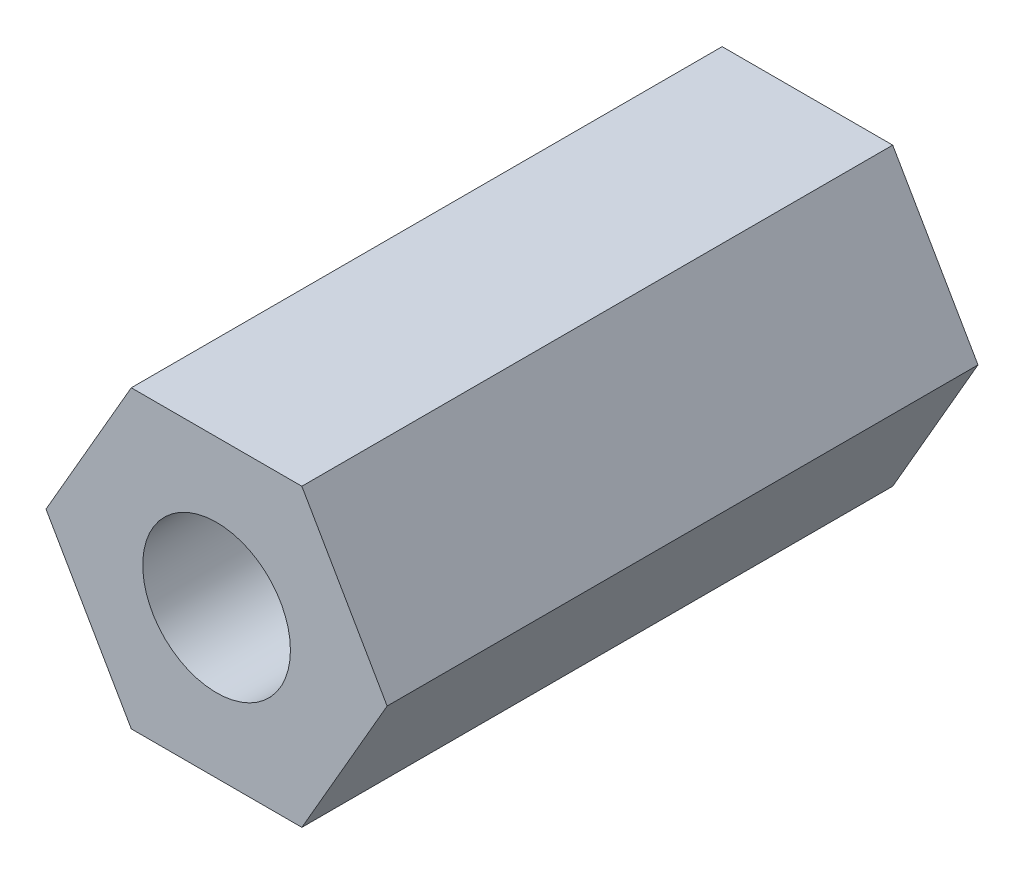
ISO-10303-21;
HEADER;
FILE_DESCRIPTION(('STEP AP214'),'2;1');
FILE_NAME('part.step','',(''),(''),'','','');
FILE_SCHEMA(('AUTOMOTIVE_DESIGN { 1 0 10303 214 1 1 1 1 }'));
ENDSEC;
DATA;
#1=APPLICATION_CONTEXT('core data for automotive mechanical design processes');
#2=APPLICATION_PROTOCOL_DEFINITION('international standard','automotive_design',2000,#1);
#3=PRODUCT_CONTEXT('',#1,'mechanical');
#4=PRODUCT('Part','Part','',(#3));
#5=PRODUCT_RELATED_PRODUCT_CATEGORY('part','',(#4));
#6=PRODUCT_DEFINITION_FORMATION('','',#4);
#7=PRODUCT_DEFINITION_CONTEXT('part definition',#1,'design');
#8=PRODUCT_DEFINITION('design','',#6,#7);
#9=PRODUCT_DEFINITION_SHAPE('','',#8);
#10=(LENGTH_UNIT() NAMED_UNIT(*) SI_UNIT(.MILLI.,.METRE.));
#11=(NAMED_UNIT(*) PLANE_ANGLE_UNIT() SI_UNIT($,.RADIAN.));
#12=(NAMED_UNIT(*) SI_UNIT($,.STERADIAN.) SOLID_ANGLE_UNIT());
#13=UNCERTAINTY_MEASURE_WITH_UNIT(LENGTH_MEASURE(1.E-05),#10,'distance_accuracy_value','');
#14=(GEOMETRIC_REPRESENTATION_CONTEXT(3) GLOBAL_UNCERTAINTY_ASSIGNED_CONTEXT((#13)) GLOBAL_UNIT_ASSIGNED_CONTEXT((#10,
#11,#12)) REPRESENTATION_CONTEXT('',''));
#15=CARTESIAN_POINT('',(0.,0.,0.));
#16=DIRECTION('',(0.,0.,1.));
#17=DIRECTION('',(1.,0.,0.));
#18=AXIS2_PLACEMENT_3D('',#15,#16,#17);
#19=CARTESIAN_POINT('',(0.,0.,12.));
#20=DIRECTION('',(0.,0.,1.));
#21=DIRECTION('',(1.,0.,0.));
#22=AXIS2_PLACEMENT_3D('',#19,#20,#21);
#23=PLANE('',#22);
#24=DIRECTION('',(0.499999999999995,0.866025403784441,0.));
#25=VECTOR('',#24,1.);
#26=CARTESIAN_POINT('',(1.73205080756891,-2.99999999999998,12.));
#27=LINE('',#26,#25);
#28=CARTESIAN_POINT('',(1.73205080756891,-2.99999999999998,12.));
#29=VERTEX_POINT('',#28);
#30=CARTESIAN_POINT('',(3.46410161513776,0.,12.));
#31=VERTEX_POINT('',#30);
#32=EDGE_CURVE('E154',#29,#31,#27,.T.);
#33=ORIENTED_EDGE('',*,*,#32,.T.);
#34=DIRECTION('',(-0.500000000000001,0.866025403784438,0.));
#35=VECTOR('',#34,1.);
#36=CARTESIAN_POINT('',(3.46410161513776,0.,12.));
#37=LINE('',#36,#35);
#38=CARTESIAN_POINT('',(1.73205080756887,3.00000000000001,12.));
#39=VERTEX_POINT('',#38);
#40=EDGE_CURVE('E102',#31,#39,#37,.T.);
#41=ORIENTED_EDGE('',*,*,#40,.T.);
#42=DIRECTION('',(-1.,0.,0.));
#43=VECTOR('',#42,1.);
#44=CARTESIAN_POINT('',(1.73205080756887,3.00000000000001,12.));
#45=LINE('',#44,#43);
#46=CARTESIAN_POINT('',(-1.73205080756889,2.99999999999999,12.));
#47=VERTEX_POINT('',#46);
#48=EDGE_CURVE('E115',#39,#47,#45,.T.);
#49=ORIENTED_EDGE('',*,*,#48,.T.);
#50=DIRECTION('',(-0.499999999999995,-0.866025403784442,0.));
#51=VECTOR('',#50,1.);
#52=CARTESIAN_POINT('',(-1.73205080756889,2.99999999999999,12.));
#53=LINE('',#52,#51);
#54=CARTESIAN_POINT('',(-3.46410161513776,0.,12.));
#55=VERTEX_POINT('',#54);
#56=EDGE_CURVE('E109',#47,#55,#53,.T.);
#57=ORIENTED_EDGE('',*,*,#56,.T.);
#58=DIRECTION('',(0.500000000000007,-0.866025403784434,0.));
#59=VECTOR('',#58,1.);
#60=CARTESIAN_POINT('',(-3.46410161513776,0.,12.));
#61=LINE('',#60,#59);
#62=CARTESIAN_POINT('',(-1.73205080756885,-3.00000000000002,12.));
#63=VERTEX_POINT('',#62);
#64=EDGE_CURVE('E113',#55,#63,#61,.T.);
#65=ORIENTED_EDGE('',*,*,#64,.T.);
#66=DIRECTION('',(1.,0.,0.));
#67=VECTOR('',#66,1.);
#68=CARTESIAN_POINT('',(-1.73205080756885,-3.00000000000002,12.));
#69=LINE('',#68,#67);
#70=EDGE_CURVE('E65',#63,#29,#69,.T.);
#71=ORIENTED_EDGE('',*,*,#70,.T.);
#72=EDGE_LOOP('',(#33,#41,#49,#57,#65,#71));
#73=FACE_BOUND('',#72,.T.);
#74=CARTESIAN_POINT('',(0.,0.,12.));
#75=DIRECTION('',(0.,0.,1.));
#76=DIRECTION('',(1.,0.,0.));
#77=AXIS2_PLACEMENT_3D('',#74,#75,#76);
#78=CIRCLE('',#77,1.5);
#79=CARTESIAN_POINT('',(1.5,0.,12.));
#80=VERTEX_POINT('',#79);
#81=EDGE_CURVE('E142',#80,#80,#78,.T.);
#82=ORIENTED_EDGE('',*,*,#81,.F.);
#83=EDGE_LOOP('',(#82));
#84=FACE_BOUND('',#83,.T.);
#85=ADVANCED_FACE('F47',(#73,#84),#23,.T.);
#86=CARTESIAN_POINT('',(0.,0.,0.));
#87=DIRECTION('',(0.,0.,1.));
#88=DIRECTION('',(1.,0.,0.));
#89=AXIS2_PLACEMENT_3D('',#86,#87,#88);
#90=PLANE('',#89);
#91=DIRECTION('',(0.499999999999995,0.866025403784441,0.));
#92=VECTOR('',#91,1.);
#93=CARTESIAN_POINT('',(1.73205080756891,-2.99999999999998,0.));
#94=LINE('',#93,#92);
#95=CARTESIAN_POINT('',(1.73205080756891,-2.99999999999998,0.));
#96=VERTEX_POINT('',#95);
#97=CARTESIAN_POINT('',(3.46410161513776,0.,0.));
#98=VERTEX_POINT('',#97);
#99=EDGE_CURVE('E137',#96,#98,#94,.T.);
#100=ORIENTED_EDGE('',*,*,#99,.F.);
#101=DIRECTION('',(1.,0.,0.));
#102=VECTOR('',#101,1.);
#103=CARTESIAN_POINT('',(-1.73205080756885,-3.00000000000002,0.));
#104=LINE('',#103,#102);
#105=CARTESIAN_POINT('',(-1.73205080756885,-3.00000000000002,0.));
#106=VERTEX_POINT('',#105);
#107=EDGE_CURVE('E94',#106,#96,#104,.T.);
#108=ORIENTED_EDGE('',*,*,#107,.F.);
#109=DIRECTION('',(0.500000000000007,-0.866025403784434,0.));
#110=VECTOR('',#109,1.);
#111=CARTESIAN_POINT('',(-3.46410161513776,0.,0.));
#112=LINE('',#111,#110);
#113=CARTESIAN_POINT('',(-3.46410161513776,0.,0.));
#114=VERTEX_POINT('',#113);
#115=EDGE_CURVE('E88',#114,#106,#112,.T.);
#116=ORIENTED_EDGE('',*,*,#115,.F.);
#117=DIRECTION('',(-0.499999999999995,-0.866025403784442,0.));
#118=VECTOR('',#117,1.);
#119=CARTESIAN_POINT('',(-1.73205080756889,2.99999999999999,0.));
#120=LINE('',#119,#118);
#121=CARTESIAN_POINT('',(-1.73205080756889,2.99999999999999,0.));
#122=VERTEX_POINT('',#121);
#123=EDGE_CURVE('E124',#122,#114,#120,.T.);
#124=ORIENTED_EDGE('',*,*,#123,.F.);
#125=DIRECTION('',(-1.,0.,0.));
#126=VECTOR('',#125,1.);
#127=CARTESIAN_POINT('',(1.73205080756887,3.00000000000001,0.));
#128=LINE('',#127,#126);
#129=CARTESIAN_POINT('',(1.73205080756887,3.00000000000001,0.));
#130=VERTEX_POINT('',#129);
#131=EDGE_CURVE('E145',#130,#122,#128,.T.);
#132=ORIENTED_EDGE('',*,*,#131,.F.);
#133=DIRECTION('',(-0.500000000000001,0.866025403784438,0.));
#134=VECTOR('',#133,1.);
#135=CARTESIAN_POINT('',(3.46410161513776,0.,0.));
#136=LINE('',#135,#134);
#137=EDGE_CURVE('E141',#98,#130,#136,.T.);
#138=ORIENTED_EDGE('',*,*,#137,.F.);
#139=EDGE_LOOP('',(#100,#108,#116,#124,#132,#138));
#140=FACE_BOUND('',#139,.T.);
#141=CARTESIAN_POINT('',(0.,0.,0.));
#142=DIRECTION('',(0.,0.,1.));
#143=DIRECTION('',(1.,0.,0.));
#144=AXIS2_PLACEMENT_3D('',#141,#142,#143);
#145=CIRCLE('',#144,1.5);
#146=CARTESIAN_POINT('',(1.5,0.,0.));
#147=VERTEX_POINT('',#146);
#148=EDGE_CURVE('E251',#147,#147,#145,.T.);
#149=ORIENTED_EDGE('',*,*,#148,.T.);
#150=EDGE_LOOP('',(#149));
#151=FACE_BOUND('',#150,.T.);
#152=ADVANCED_FACE('F167',(#140,#151),#90,.F.);
#153=CARTESIAN_POINT('',(1.73205080756891,-2.99999999999998,12.));
#154=DIRECTION('',(-0.866025403784441,0.499999999999995,0.));
#155=DIRECTION('',(-0.499999999999995,-0.866025403784442,0.));
#156=AXIS2_PLACEMENT_3D('',#153,#154,#155);
#157=PLANE('',#156);
#158=ORIENTED_EDGE('',*,*,#99,.T.);
#159=DIRECTION('',(0.,0.,-1.));
#160=VECTOR('',#159,1.);
#161=CARTESIAN_POINT('',(3.46410161513776,0.,12.));
#162=LINE('',#161,#160);
#163=EDGE_CURVE('E11',#31,#98,#162,.T.);
#164=ORIENTED_EDGE('',*,*,#163,.F.);
#165=ORIENTED_EDGE('',*,*,#32,.F.);
#166=DIRECTION('',(0.,0.,-1.));
#167=VECTOR('',#166,1.);
#168=CARTESIAN_POINT('',(1.73205080756891,-2.99999999999998,12.));
#169=LINE('',#168,#167);
#170=EDGE_CURVE('E133',#29,#96,#169,.T.);
#171=ORIENTED_EDGE('',*,*,#170,.T.);
#172=EDGE_LOOP('',(#158,#164,#165,#171));
#173=FACE_BOUND('',#172,.T.);
#174=ADVANCED_FACE('F49',(#173),#157,.F.);
#175=CARTESIAN_POINT('',(3.46410161513776,0.,12.));
#176=DIRECTION('',(-0.866025403784438,-0.500000000000001,0.));
#177=DIRECTION('',(0.500000000000001,-0.866025403784438,0.));
#178=AXIS2_PLACEMENT_3D('',#175,#176,#177);
#179=PLANE('',#178);
#180=ORIENTED_EDGE('',*,*,#137,.T.);
#181=DIRECTION('',(0.,0.,-1.));
#182=VECTOR('',#181,1.);
#183=CARTESIAN_POINT('',(1.73205080756887,3.00000000000001,12.));
#184=LINE('',#183,#182);
#185=EDGE_CURVE('E57',#39,#130,#184,.T.);
#186=ORIENTED_EDGE('',*,*,#185,.F.);
#187=ORIENTED_EDGE('',*,*,#40,.F.);
#188=ORIENTED_EDGE('',*,*,#163,.T.);
#189=EDGE_LOOP('',(#180,#186,#187,#188));
#190=FACE_BOUND('',#189,.T.);
#191=ADVANCED_FACE('F192',(#190),#179,.F.);
#192=CARTESIAN_POINT('',(1.73205080756887,3.00000000000001,12.));
#193=DIRECTION('',(0.,-1.,0.));
#194=DIRECTION('',(1.,0.,0.));
#195=AXIS2_PLACEMENT_3D('',#192,#193,#194);
#196=PLANE('',#195);
#197=ORIENTED_EDGE('',*,*,#131,.T.);
#198=DIRECTION('',(0.,0.,-1.));
#199=VECTOR('',#198,1.);
#200=CARTESIAN_POINT('',(-1.73205080756889,2.99999999999999,12.));
#201=LINE('',#200,#199);
#202=EDGE_CURVE('E126',#47,#122,#201,.T.);
#203=ORIENTED_EDGE('',*,*,#202,.F.);
#204=ORIENTED_EDGE('',*,*,#48,.F.);
#205=ORIENTED_EDGE('',*,*,#185,.T.);
#206=EDGE_LOOP('',(#197,#203,#204,#205));
#207=FACE_BOUND('',#206,.T.);
#208=ADVANCED_FACE('F164',(#207),#196,.F.);
#209=CARTESIAN_POINT('',(-1.73205080756889,2.99999999999999,12.));
#210=DIRECTION('',(0.866025403784441,-0.499999999999995,0.));
#211=DIRECTION('',(0.499999999999995,0.866025403784442,0.));
#212=AXIS2_PLACEMENT_3D('',#209,#210,#211);
#213=PLANE('',#212);
#214=ORIENTED_EDGE('',*,*,#123,.T.);
#215=DIRECTION('',(0.,0.,-1.));
#216=VECTOR('',#215,1.);
#217=CARTESIAN_POINT('',(-3.46410161513776,0.,12.));
#218=LINE('',#217,#216);
#219=EDGE_CURVE('E121',#55,#114,#218,.T.);
#220=ORIENTED_EDGE('',*,*,#219,.F.);
#221=ORIENTED_EDGE('',*,*,#56,.F.);
#222=ORIENTED_EDGE('',*,*,#202,.T.);
#223=EDGE_LOOP('',(#214,#220,#221,#222));
#224=FACE_BOUND('',#223,.T.);
#225=ADVANCED_FACE('F122',(#224),#213,.F.);
#226=CARTESIAN_POINT('',(-3.46410161513776,0.,12.));
#227=DIRECTION('',(0.866025403784435,0.500000000000007,0.));
#228=DIRECTION('',(-0.500000000000007,0.866025403784434,0.));
#229=AXIS2_PLACEMENT_3D('',#226,#227,#228);
#230=PLANE('',#229);
#231=ORIENTED_EDGE('',*,*,#115,.T.);
#232=DIRECTION('',(0.,0.,-1.));
#233=VECTOR('',#232,1.);
#234=CARTESIAN_POINT('',(-1.73205080756885,-3.00000000000002,12.));
#235=LINE('',#234,#233);
#236=EDGE_CURVE('E127',#63,#106,#235,.T.);
#237=ORIENTED_EDGE('',*,*,#236,.F.);
#238=ORIENTED_EDGE('',*,*,#64,.F.);
#239=ORIENTED_EDGE('',*,*,#219,.T.);
#240=EDGE_LOOP('',(#231,#237,#238,#239));
#241=FACE_BOUND('',#240,.T.);
#242=ADVANCED_FACE('F129',(#241),#230,.F.);
#243=CARTESIAN_POINT('',(-1.73205080756885,-3.00000000000002,12.));
#244=DIRECTION('',(0.,1.,0.));
#245=DIRECTION('',(-1.,0.,0.));
#246=AXIS2_PLACEMENT_3D('',#243,#244,#245);
#247=PLANE('',#246);
#248=ORIENTED_EDGE('',*,*,#107,.T.);
#249=ORIENTED_EDGE('',*,*,#170,.F.);
#250=ORIENTED_EDGE('',*,*,#70,.F.);
#251=ORIENTED_EDGE('',*,*,#236,.T.);
#252=EDGE_LOOP('',(#248,#249,#250,#251));
#253=FACE_BOUND('',#252,.T.);
#254=ADVANCED_FACE('F172',(#253),#247,.F.);
#255=CARTESIAN_POINT('',(0.,0.,12.));
#256=DIRECTION('',(0.,0.,-1.));
#257=DIRECTION('',(-1.,0.,0.));
#258=AXIS2_PLACEMENT_3D('',#255,#256,#257);
#259=CYLINDRICAL_SURFACE('',#258,1.5);
#260=ORIENTED_EDGE('',*,*,#81,.T.);
#261=EDGE_LOOP('',(#260));
#262=FACE_BOUND('',#261,.T.);
#263=ORIENTED_EDGE('',*,*,#148,.F.);
#264=EDGE_LOOP('',(#263));
#265=FACE_BOUND('',#264,.T.);
#266=ADVANCED_FACE('F174',(#262,#265),#259,.F.);
#267=CLOSED_SHELL('',(#85,#152,#174,#191,#208,#225,#242,#254,#266));
#268=MANIFOLD_SOLID_BREP('B2',#267);
#269=ADVANCED_BREP_SHAPE_REPRESENTATION('',(#18,#268),#14);
#270=SHAPE_DEFINITION_REPRESENTATION(#9,#269);
ENDSEC;
END-ISO-10303-21;
